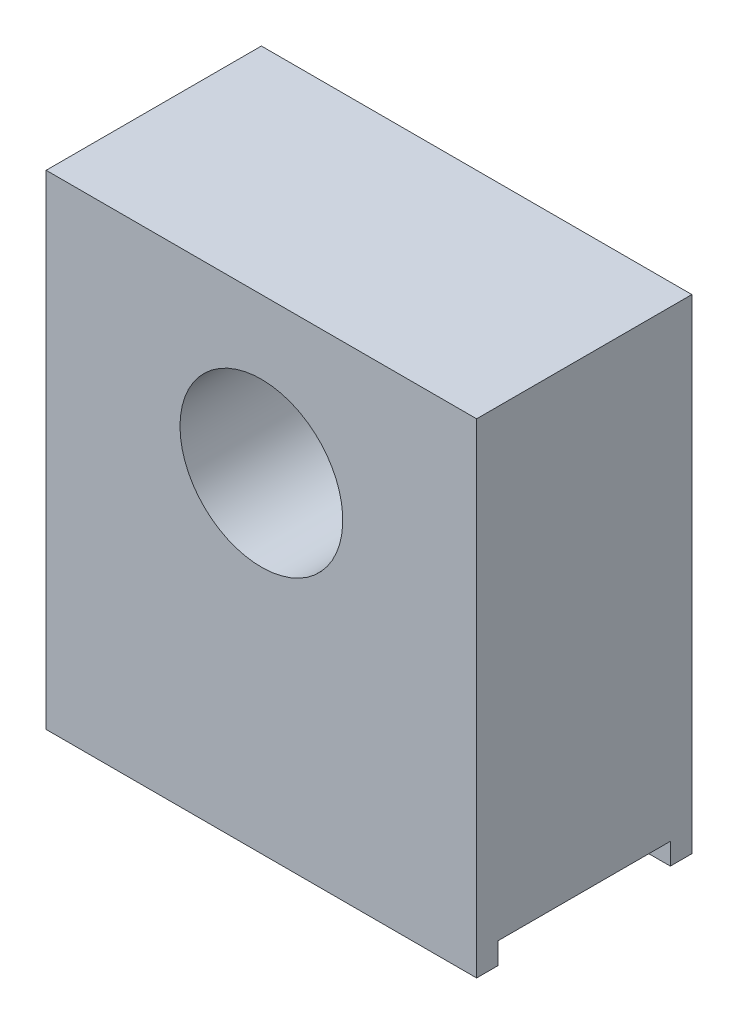
ISO-10303-21;
HEADER;
FILE_DESCRIPTION(('STEP AP214'),'2;1');
FILE_NAME('part.step','',(''),(''),'','','');
FILE_SCHEMA(('AUTOMOTIVE_DESIGN { 1 0 10303 214 1 1 1 1 }'));
ENDSEC;
DATA;
#1=APPLICATION_CONTEXT('core data for automotive mechanical design processes');
#2=APPLICATION_PROTOCOL_DEFINITION('international standard','automotive_design',2000,#1);
#3=PRODUCT_CONTEXT('',#1,'mechanical');
#4=PRODUCT('Part','Part','',(#3));
#5=PRODUCT_RELATED_PRODUCT_CATEGORY('part','',(#4));
#6=PRODUCT_DEFINITION_FORMATION('','',#4);
#7=PRODUCT_DEFINITION_CONTEXT('part definition',#1,'design');
#8=PRODUCT_DEFINITION('design','',#6,#7);
#9=PRODUCT_DEFINITION_SHAPE('','',#8);
#10=(LENGTH_UNIT() NAMED_UNIT(*) SI_UNIT(.MILLI.,.METRE.));
#11=(NAMED_UNIT(*) PLANE_ANGLE_UNIT() SI_UNIT($,.RADIAN.));
#12=(NAMED_UNIT(*) SI_UNIT($,.STERADIAN.) SOLID_ANGLE_UNIT());
#13=UNCERTAINTY_MEASURE_WITH_UNIT(LENGTH_MEASURE(1.E-05),#10,'distance_accuracy_value','');
#14=(GEOMETRIC_REPRESENTATION_CONTEXT(3) GLOBAL_UNCERTAINTY_ASSIGNED_CONTEXT((#13)) GLOBAL_UNIT_ASSIGNED_CONTEXT((#10,
#11,#12)) REPRESENTATION_CONTEXT('',''));
#15=CARTESIAN_POINT('',(0.,0.,0.));
#16=DIRECTION('',(0.,0.,1.));
#17=DIRECTION('',(1.,0.,0.));
#18=AXIS2_PLACEMENT_3D('',#15,#16,#17);
#19=CARTESIAN_POINT('',(0.,0.,0.));
#20=DIRECTION('',(0.,1.,0.));
#21=DIRECTION('',(0.,0.,1.));
#22=AXIS2_PLACEMENT_3D('',#19,#20,#21);
#23=PLANE('',#22);
#24=DIRECTION('',(0.,0.,1.));
#25=VECTOR('',#24,1.);
#26=CARTESIAN_POINT('',(-14.6748466257669,0.,-6.89570552147239));
#27=LINE('',#26,#25);
#28=CARTESIAN_POINT('',(-14.6748466257669,0.,7.50429447852761));
#29=VERTEX_POINT('',#28);
#30=CARTESIAN_POINT('',(-14.6748466257669,0.,9.10429447852761));
#31=VERTEX_POINT('',#30);
#32=EDGE_CURVE('E142',#29,#31,#27,.T.);
#33=ORIENTED_EDGE('',*,*,#32,.F.);
#34=DIRECTION('',(-1.,0.,0.));
#35=VECTOR('',#34,1.);
#36=CARTESIAN_POINT('',(-14.6748466257669,0.,7.50429447852761));
#37=LINE('',#36,#35);
#38=CARTESIAN_POINT('',(17.3251533742331,0.,7.50429447852761));
#39=VERTEX_POINT('',#38);
#40=EDGE_CURVE('E122',#39,#29,#37,.T.);
#41=ORIENTED_EDGE('',*,*,#40,.F.);
#42=DIRECTION('',(0.,0.,-1.));
#43=VECTOR('',#42,1.);
#44=CARTESIAN_POINT('',(17.3251533742331,0.,-6.89570552147239));
#45=LINE('',#44,#43);
#46=CARTESIAN_POINT('',(17.3251533742331,0.,9.10429447852761));
#47=VERTEX_POINT('',#46);
#48=EDGE_CURVE('E145',#47,#39,#45,.T.);
#49=ORIENTED_EDGE('',*,*,#48,.F.);
#50=DIRECTION('',(1.,0.,0.));
#51=VECTOR('',#50,1.);
#52=CARTESIAN_POINT('',(-14.6748466257669,0.,9.10429447852761));
#53=LINE('',#52,#51);
#54=EDGE_CURVE('E141',#31,#47,#53,.T.);
#55=ORIENTED_EDGE('',*,*,#54,.F.);
#56=EDGE_LOOP('',(#33,#41,#49,#55));
#57=FACE_BOUND('',#56,.T.);
#58=ADVANCED_FACE('F33',(#57),#23,.F.);
#59=CARTESIAN_POINT('',(-14.6748466257669,36.,-6.89570552147239));
#60=DIRECTION('',(1.,0.,0.));
#61=DIRECTION('',(0.,0.,-1.));
#62=AXIS2_PLACEMENT_3D('',#59,#60,#61);
#63=PLANE('',#62);
#64=DIRECTION('',(0.,0.,-1.));
#65=VECTOR('',#64,1.);
#66=CARTESIAN_POINT('',(-14.6748466257669,1.6,-5.29570552147239));
#67=LINE('',#66,#65);
#68=CARTESIAN_POINT('',(-14.6748466257669,1.6,7.50429447852761));
#69=VERTEX_POINT('',#68);
#70=CARTESIAN_POINT('',(-14.6748466257669,1.6,-5.29570552147239));
#71=VERTEX_POINT('',#70);
#72=EDGE_CURVE('E113',#69,#71,#67,.T.);
#73=ORIENTED_EDGE('',*,*,#72,.F.);
#74=DIRECTION('',(0.,-1.,0.));
#75=VECTOR('',#74,1.);
#76=CARTESIAN_POINT('',(-14.6748466257669,1.6,7.50429447852761));
#77=LINE('',#76,#75);
#78=EDGE_CURVE('E168',#69,#29,#77,.T.);
#79=ORIENTED_EDGE('',*,*,#78,.T.);
#80=ORIENTED_EDGE('',*,*,#32,.T.);
#81=DIRECTION('',(0.,-1.,0.));
#82=VECTOR('',#81,1.);
#83=CARTESIAN_POINT('',(-14.6748466257669,36.,9.10429447852761));
#84=LINE('',#83,#82);
#85=CARTESIAN_POINT('',(-14.6748466257669,36.,9.10429447852761));
#86=VERTEX_POINT('',#85);
#87=EDGE_CURVE('E11',#86,#31,#84,.T.);
#88=ORIENTED_EDGE('',*,*,#87,.F.);
#89=DIRECTION('',(0.,0.,1.));
#90=VECTOR('',#89,1.);
#91=CARTESIAN_POINT('',(-14.6748466257669,36.,-6.89570552147239));
#92=LINE('',#91,#90);
#93=CARTESIAN_POINT('',(-14.6748466257669,36.,-6.89570552147239));
#94=VERTEX_POINT('',#93);
#95=EDGE_CURVE('E133',#94,#86,#92,.T.);
#96=ORIENTED_EDGE('',*,*,#95,.F.);
#97=DIRECTION('',(0.,-1.,0.));
#98=VECTOR('',#97,1.);
#99=CARTESIAN_POINT('',(-14.6748466257669,36.,-6.89570552147239));
#100=LINE('',#99,#98);
#101=CARTESIAN_POINT('',(-14.6748466257669,0.,-6.89570552147239));
#102=VERTEX_POINT('',#101);
#103=EDGE_CURVE('E139',#94,#102,#100,.T.);
#104=ORIENTED_EDGE('',*,*,#103,.T.);
#105=CARTESIAN_POINT('',(-14.6748466257669,0.,-5.29570552147239));
#106=VERTEX_POINT('',#105);
#107=EDGE_CURVE('E126',#102,#106,#27,.T.);
#108=ORIENTED_EDGE('',*,*,#107,.T.);
#109=DIRECTION('',(0.,-1.,0.));
#110=VECTOR('',#109,1.);
#111=CARTESIAN_POINT('',(-14.6748466257669,1.6,-5.29570552147239));
#112=LINE('',#111,#110);
#113=EDGE_CURVE('E48',#71,#106,#112,.T.);
#114=ORIENTED_EDGE('',*,*,#113,.F.);
#115=EDGE_LOOP('',(#73,#79,#80,#88,#96,#104,#108,#114));
#116=FACE_BOUND('',#115,.T.);
#117=ADVANCED_FACE('F35',(#116),#63,.F.);
#118=CARTESIAN_POINT('',(-14.6748466257669,36.,9.10429447852761));
#119=DIRECTION('',(0.,0.,-1.));
#120=DIRECTION('',(-1.,0.,0.));
#121=AXIS2_PLACEMENT_3D('',#118,#119,#120);
#122=PLANE('',#121);
#123=CARTESIAN_POINT('',(1.32515337423313,24.5,9.10429447852761));
#124=DIRECTION('',(0.,0.,-1.));
#125=DIRECTION('',(-1.,0.,0.));
#126=AXIS2_PLACEMENT_3D('',#123,#124,#125);
#127=CIRCLE('',#126,6.05);
#128=CARTESIAN_POINT('',(-4.72484662576687,24.5,9.10429447852761));
#129=VERTEX_POINT('',#128);
#130=EDGE_CURVE('E165',#129,#129,#127,.T.);
#131=ORIENTED_EDGE('',*,*,#130,.T.);
#132=EDGE_LOOP('',(#131));
#133=FACE_BOUND('',#132,.T.);
#134=ORIENTED_EDGE('',*,*,#54,.T.);
#135=DIRECTION('',(0.,-1.,0.));
#136=VECTOR('',#135,1.);
#137=CARTESIAN_POINT('',(17.3251533742331,36.,9.10429447852761));
#138=LINE('',#137,#136);
#139=CARTESIAN_POINT('',(17.3251533742331,36.,9.10429447852761));
#140=VERTEX_POINT('',#139);
#141=EDGE_CURVE('E41',#140,#47,#138,.T.);
#142=ORIENTED_EDGE('',*,*,#141,.F.);
#143=DIRECTION('',(1.,0.,0.));
#144=VECTOR('',#143,1.);
#145=CARTESIAN_POINT('',(-14.6748466257669,36.,9.10429447852761));
#146=LINE('',#145,#144);
#147=EDGE_CURVE('E85',#86,#140,#146,.T.);
#148=ORIENTED_EDGE('',*,*,#147,.F.);
#149=ORIENTED_EDGE('',*,*,#87,.T.);
#150=EDGE_LOOP('',(#134,#142,#148,#149));
#151=FACE_BOUND('',#150,.T.);
#152=ADVANCED_FACE('F179',(#133,#151),#122,.F.);
#153=CARTESIAN_POINT('',(17.3251533742331,36.,-6.89570552147239));
#154=DIRECTION('',(-1.,0.,0.));
#155=DIRECTION('',(0.,0.,1.));
#156=AXIS2_PLACEMENT_3D('',#153,#154,#155);
#157=PLANE('',#156);
#158=ORIENTED_EDGE('',*,*,#48,.T.);
#159=DIRECTION('',(0.,-1.,0.));
#160=VECTOR('',#159,1.);
#161=CARTESIAN_POINT('',(17.3251533742331,1.6,7.50429447852761));
#162=LINE('',#161,#160);
#163=CARTESIAN_POINT('',(17.3251533742331,1.6,7.50429447852761));
#164=VERTEX_POINT('',#163);
#165=EDGE_CURVE('E128',#164,#39,#162,.T.);
#166=ORIENTED_EDGE('',*,*,#165,.F.);
#167=DIRECTION('',(0.,0.,1.));
#168=VECTOR('',#167,1.);
#169=CARTESIAN_POINT('',(17.3251533742331,1.6,-5.29570552147239));
#170=LINE('',#169,#168);
#171=CARTESIAN_POINT('',(17.3251533742331,1.6,-5.29570552147239));
#172=VERTEX_POINT('',#171);
#173=EDGE_CURVE('E112',#172,#164,#170,.T.);
#174=ORIENTED_EDGE('',*,*,#173,.F.);
#175=DIRECTION('',(0.,-1.,0.));
#176=VECTOR('',#175,1.);
#177=CARTESIAN_POINT('',(17.3251533742331,1.6,-5.29570552147239));
#178=LINE('',#177,#176);
#179=CARTESIAN_POINT('',(17.3251533742331,0.,-5.29570552147239));
#180=VERTEX_POINT('',#179);
#181=EDGE_CURVE('E109',#172,#180,#178,.T.);
#182=ORIENTED_EDGE('',*,*,#181,.T.);
#183=CARTESIAN_POINT('',(17.3251533742331,0.,-6.89570552147239));
#184=VERTEX_POINT('',#183);
#185=EDGE_CURVE('E144',#180,#184,#45,.T.);
#186=ORIENTED_EDGE('',*,*,#185,.T.);
#187=DIRECTION('',(0.,-1.,0.));
#188=VECTOR('',#187,1.);
#189=CARTESIAN_POINT('',(17.3251533742331,36.,-6.89570552147239));
#190=LINE('',#189,#188);
#191=CARTESIAN_POINT('',(17.3251533742331,36.,-6.89570552147239));
#192=VERTEX_POINT('',#191);
#193=EDGE_CURVE('E150',#192,#184,#190,.T.);
#194=ORIENTED_EDGE('',*,*,#193,.F.);
#195=DIRECTION('',(0.,0.,-1.));
#196=VECTOR('',#195,1.);
#197=CARTESIAN_POINT('',(17.3251533742331,36.,-6.89570552147239));
#198=LINE('',#197,#196);
#199=EDGE_CURVE('E136',#140,#192,#198,.T.);
#200=ORIENTED_EDGE('',*,*,#199,.F.);
#201=ORIENTED_EDGE('',*,*,#141,.T.);
#202=EDGE_LOOP('',(#158,#166,#174,#182,#186,#194,#200,#201));
#203=FACE_BOUND('',#202,.T.);
#204=ADVANCED_FACE('F155',(#203),#157,.F.);
#205=CARTESIAN_POINT('',(-14.6748466257669,36.,-6.89570552147239));
#206=DIRECTION('',(0.,0.,1.));
#207=DIRECTION('',(1.,0.,0.));
#208=AXIS2_PLACEMENT_3D('',#205,#206,#207);
#209=PLANE('',#208);
#210=CARTESIAN_POINT('',(1.32515337423313,24.5,-6.89570552147239));
#211=DIRECTION('',(0.,0.,-1.));
#212=DIRECTION('',(-1.,0.,0.));
#213=AXIS2_PLACEMENT_3D('',#210,#211,#212);
#214=CIRCLE('',#213,6.05);
#215=CARTESIAN_POINT('',(-4.72484662576687,24.5,-6.89570552147239));
#216=VERTEX_POINT('',#215);
#217=EDGE_CURVE('E173',#216,#216,#214,.T.);
#218=ORIENTED_EDGE('',*,*,#217,.F.);
#219=EDGE_LOOP('',(#218));
#220=FACE_BOUND('',#219,.T.);
#221=DIRECTION('',(-1.,0.,0.));
#222=VECTOR('',#221,1.);
#223=CARTESIAN_POINT('',(-14.6748466257669,0.,-6.89570552147239));
#224=LINE('',#223,#222);
#225=EDGE_CURVE('E78',#184,#102,#224,.T.);
#226=ORIENTED_EDGE('',*,*,#225,.T.);
#227=ORIENTED_EDGE('',*,*,#103,.F.);
#228=DIRECTION('',(-1.,0.,0.));
#229=VECTOR('',#228,1.);
#230=CARTESIAN_POINT('',(-14.6748466257669,36.,-6.89570552147239));
#231=LINE('',#230,#229);
#232=EDGE_CURVE('E57',#192,#94,#231,.T.);
#233=ORIENTED_EDGE('',*,*,#232,.F.);
#234=ORIENTED_EDGE('',*,*,#193,.T.);
#235=EDGE_LOOP('',(#226,#227,#233,#234));
#236=FACE_BOUND('',#235,.T.);
#237=ADVANCED_FACE('F187',(#220,#236),#209,.F.);
#238=CARTESIAN_POINT('',(0.,36.,0.));
#239=DIRECTION('',(0.,1.,0.));
#240=DIRECTION('',(0.,0.,1.));
#241=AXIS2_PLACEMENT_3D('',#238,#239,#240);
#242=PLANE('',#241);
#243=ORIENTED_EDGE('',*,*,#95,.T.);
#244=ORIENTED_EDGE('',*,*,#147,.T.);
#245=ORIENTED_EDGE('',*,*,#199,.T.);
#246=ORIENTED_EDGE('',*,*,#232,.T.);
#247=EDGE_LOOP('',(#243,#244,#245,#246));
#248=FACE_BOUND('',#247,.T.);
#249=ADVANCED_FACE('F189',(#248),#242,.T.);
#250=ORIENTED_EDGE('',*,*,#185,.F.);
#251=DIRECTION('',(1.,0.,0.));
#252=VECTOR('',#251,1.);
#253=CARTESIAN_POINT('',(-14.6748466257669,0.,-5.29570552147239));
#254=LINE('',#253,#252);
#255=EDGE_CURVE('E163',#106,#180,#254,.T.);
#256=ORIENTED_EDGE('',*,*,#255,.F.);
#257=ORIENTED_EDGE('',*,*,#107,.F.);
#258=ORIENTED_EDGE('',*,*,#225,.F.);
#259=EDGE_LOOP('',(#250,#256,#257,#258));
#260=FACE_BOUND('',#259,.T.);
#261=ADVANCED_FACE('F195',(#260),#23,.F.);
#262=CARTESIAN_POINT('',(-14.6748466257669,1.6,7.50429447852761));
#263=DIRECTION('',(0.,0.,1.));
#264=DIRECTION('',(1.,0.,0.));
#265=AXIS2_PLACEMENT_3D('',#262,#263,#264);
#266=PLANE('',#265);
#267=ORIENTED_EDGE('',*,*,#40,.T.);
#268=ORIENTED_EDGE('',*,*,#78,.F.);
#269=DIRECTION('',(-1.,0.,0.));
#270=VECTOR('',#269,1.);
#271=CARTESIAN_POINT('',(-14.6748466257669,1.6,7.50429447852761));
#272=LINE('',#271,#270);
#273=EDGE_CURVE('E119',#164,#69,#272,.T.);
#274=ORIENTED_EDGE('',*,*,#273,.F.);
#275=ORIENTED_EDGE('',*,*,#165,.T.);
#276=EDGE_LOOP('',(#267,#268,#274,#275));
#277=FACE_BOUND('',#276,.T.);
#278=ADVANCED_FACE('F169',(#277),#266,.F.);
#279=CARTESIAN_POINT('',(-14.6748466257669,1.6,-5.29570552147239));
#280=DIRECTION('',(0.,0.,-1.));
#281=DIRECTION('',(-1.,0.,0.));
#282=AXIS2_PLACEMENT_3D('',#279,#280,#281);
#283=PLANE('',#282);
#284=ORIENTED_EDGE('',*,*,#255,.T.);
#285=ORIENTED_EDGE('',*,*,#181,.F.);
#286=DIRECTION('',(1.,0.,0.));
#287=VECTOR('',#286,1.);
#288=CARTESIAN_POINT('',(-14.6748466257669,1.6,-5.29570552147239));
#289=LINE('',#288,#287);
#290=EDGE_CURVE('E105',#71,#172,#289,.T.);
#291=ORIENTED_EDGE('',*,*,#290,.F.);
#292=ORIENTED_EDGE('',*,*,#113,.T.);
#293=EDGE_LOOP('',(#284,#285,#291,#292));
#294=FACE_BOUND('',#293,.T.);
#295=ADVANCED_FACE('F107',(#294),#283,.F.);
#296=CARTESIAN_POINT('',(0.,1.6,0.));
#297=DIRECTION('',(0.,1.,0.));
#298=DIRECTION('',(0.,0.,1.));
#299=AXIS2_PLACEMENT_3D('',#296,#297,#298);
#300=PLANE('',#299);
#301=ORIENTED_EDGE('',*,*,#72,.T.);
#302=ORIENTED_EDGE('',*,*,#290,.T.);
#303=ORIENTED_EDGE('',*,*,#173,.T.);
#304=ORIENTED_EDGE('',*,*,#273,.T.);
#305=EDGE_LOOP('',(#301,#302,#303,#304));
#306=FACE_BOUND('',#305,.T.);
#307=ADVANCED_FACE('F117',(#306),#300,.F.);
#308=CARTESIAN_POINT('',(1.32515337423313,24.5,9.10429447852761));
#309=DIRECTION('',(0.,0.,-1.));
#310=DIRECTION('',(-1.,0.,0.));
#311=AXIS2_PLACEMENT_3D('',#308,#309,#310);
#312=CYLINDRICAL_SURFACE('',#311,6.05);
#313=ORIENTED_EDGE('',*,*,#130,.F.);
#314=EDGE_LOOP('',(#313));
#315=FACE_BOUND('',#314,.T.);
#316=ORIENTED_EDGE('',*,*,#217,.T.);
#317=EDGE_LOOP('',(#316));
#318=FACE_BOUND('',#317,.T.);
#319=ADVANCED_FACE('F181',(#315,#318),#312,.F.);
#320=CLOSED_SHELL('',(#58,#117,#152,#204,#237,#249,#261,#278,#295,#307,#319));
#321=MANIFOLD_SOLID_BREP('B2',#320);
#322=ADVANCED_BREP_SHAPE_REPRESENTATION('',(#18,#321),#14);
#323=SHAPE_DEFINITION_REPRESENTATION(#9,#322);
ENDSEC;
END-ISO-10303-21;
